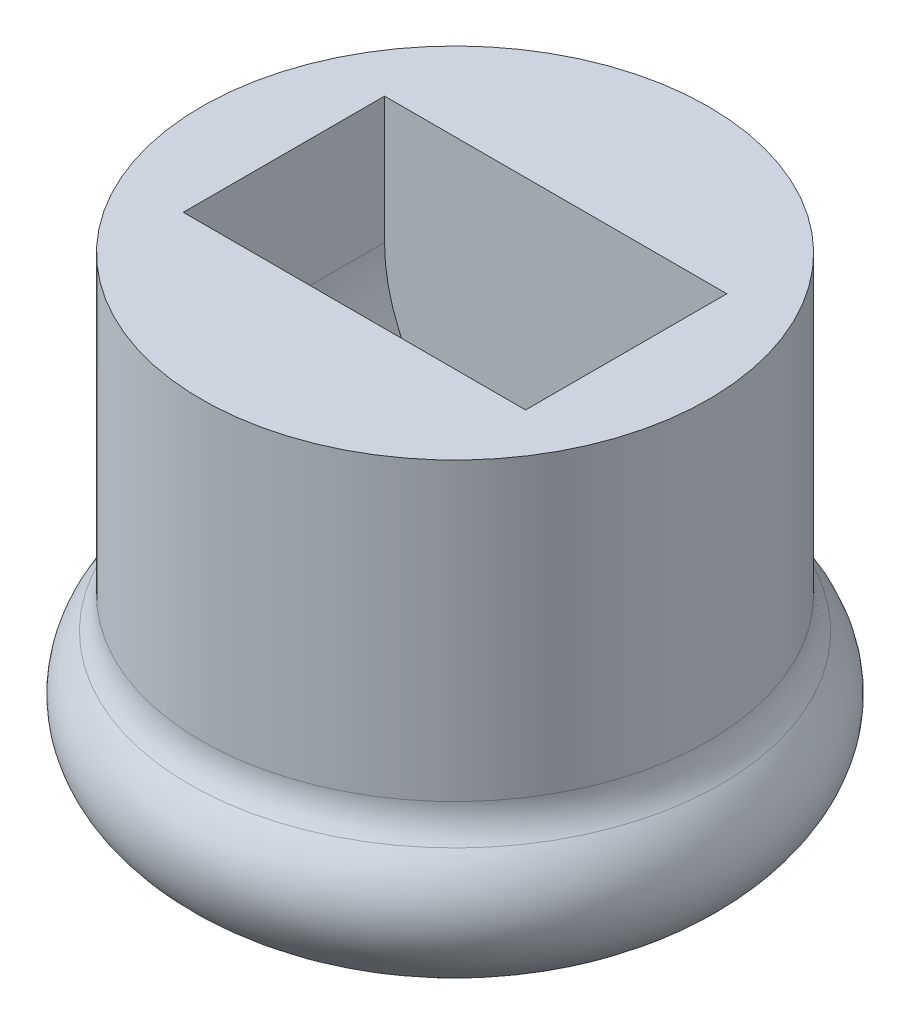
ISO-10303-21;
HEADER;
FILE_DESCRIPTION(('STEP AP214'),'2;1');
FILE_NAME('part.step','',(''),(''),'','','');
FILE_SCHEMA(('AUTOMOTIVE_DESIGN { 1 0 10303 214 1 1 1 1 }'));
ENDSEC;
DATA;
#1=APPLICATION_CONTEXT('core data for automotive mechanical design processes');
#2=APPLICATION_PROTOCOL_DEFINITION('international standard','automotive_design',2000,#1);
#3=PRODUCT_CONTEXT('',#1,'mechanical');
#4=PRODUCT('Part','Part','',(#3));
#5=PRODUCT_RELATED_PRODUCT_CATEGORY('part','',(#4));
#6=PRODUCT_DEFINITION_FORMATION('','',#4);
#7=PRODUCT_DEFINITION_CONTEXT('part definition',#1,'design');
#8=PRODUCT_DEFINITION('design','',#6,#7);
#9=PRODUCT_DEFINITION_SHAPE('','',#8);
#10=(LENGTH_UNIT() NAMED_UNIT(*) SI_UNIT(.MILLI.,.METRE.));
#11=(NAMED_UNIT(*) PLANE_ANGLE_UNIT() SI_UNIT($,.RADIAN.));
#12=(NAMED_UNIT(*) SI_UNIT($,.STERADIAN.) SOLID_ANGLE_UNIT());
#13=UNCERTAINTY_MEASURE_WITH_UNIT(LENGTH_MEASURE(1.E-05),#10,'distance_accuracy_value','');
#14=(GEOMETRIC_REPRESENTATION_CONTEXT(3) GLOBAL_UNCERTAINTY_ASSIGNED_CONTEXT((#13)) GLOBAL_UNIT_ASSIGNED_CONTEXT((#10,
#11,#12)) REPRESENTATION_CONTEXT('',''));
#15=CARTESIAN_POINT('',(0.,0.,0.));
#16=DIRECTION('',(0.,0.,1.));
#17=DIRECTION('',(1.,0.,0.));
#18=AXIS2_PLACEMENT_3D('',#15,#16,#17);
#19=CARTESIAN_POINT('',(0.,1.35221835558166,0.));
#20=DIRECTION('',(0.,-1.,0.));
#21=DIRECTION('',(0.,0.,-1.));
#22=AXIS2_PLACEMENT_3D('',#19,#20,#21);
#23=TOROIDAL_SURFACE('',#22,4.75,0.75);
#24=CARTESIAN_POINT('',(0.,1.35221835558166,0.));
#25=DIRECTION('',(0.,-1.,0.));
#26=DIRECTION('',(0.,0.,-1.));
#27=AXIS2_PLACEMENT_3D('',#24,#25,#26);
#28=CIRCLE('',#27,4.);
#29=CARTESIAN_POINT('',(0.,1.35221835558166,-4.));
#30=VERTEX_POINT('',#29);
#31=EDGE_CURVE('E11',#30,#30,#28,.T.);
#32=ORIENTED_EDGE('',*,*,#31,.T.);
#33=EDGE_LOOP('',(#32));
#34=FACE_BOUND('',#33,.T.);
#35=CARTESIAN_POINT('',(0.,0.853129288488249,0.));
#36=DIRECTION('',(0.,-1.,0.));
#37=DIRECTION('',(0.,0.,-1.));
#38=AXIS2_PLACEMENT_3D('',#35,#36,#37);
#39=CIRCLE('',#38,4.19016957647174);
#40=CARTESIAN_POINT('',(0.,0.853129288488249,-4.19016957647174));
#41=VERTEX_POINT('',#40);
#42=EDGE_CURVE('E99',#41,#41,#39,.T.);
#43=ORIENTED_EDGE('',*,*,#42,.F.);
#44=EDGE_LOOP('',(#43));
#45=FACE_BOUND('',#44,.T.);
#46=ADVANCED_FACE('F39',(#34,#45),#23,.F.);
#47=CARTESIAN_POINT('',(0.,6.01785476441929,0.));
#48=DIRECTION('',(0.,-1.,0.));
#49=DIRECTION('',(0.,0.,-1.));
#50=AXIS2_PLACEMENT_3D('',#47,#48,#49);
#51=CYLINDRICAL_SURFACE('',#50,4.);
#52=CARTESIAN_POINT('',(0.,6.01785476441929,0.));
#53=DIRECTION('',(0.,-1.,0.));
#54=DIRECTION('',(0.,0.,-1.));
#55=AXIS2_PLACEMENT_3D('',#52,#53,#54);
#56=CIRCLE('',#55,4.);
#57=CARTESIAN_POINT('',(0.,6.01785476441929,-4.));
#58=VERTEX_POINT('',#57);
#59=EDGE_CURVE('E47',#58,#58,#56,.T.);
#60=ORIENTED_EDGE('',*,*,#59,.T.);
#61=EDGE_LOOP('',(#60));
#62=FACE_BOUND('',#61,.T.);
#63=ORIENTED_EDGE('',*,*,#31,.F.);
#64=EDGE_LOOP('',(#63));
#65=FACE_BOUND('',#64,.T.);
#66=ADVANCED_FACE('F140',(#62,#65),#51,.T.);
#67=CARTESIAN_POINT('',(0.,6.01785476441929,-4.));
#68=DIRECTION('',(0.,1.,0.));
#69=DIRECTION('',(0.,0.,1.));
#70=AXIS2_PLACEMENT_3D('',#67,#68,#69);
#71=PLANE('',#70);
#72=DIRECTION('',(0.,0.,1.));
#73=VECTOR('',#72,1.);
#74=CARTESIAN_POINT('',(-2.7,6.01785476441929,-1.5875));
#75=LINE('',#74,#73);
#76=CARTESIAN_POINT('',(-2.7,6.01785476441929,-1.5875));
#77=VERTEX_POINT('',#76);
#78=CARTESIAN_POINT('',(-2.7,6.01785476441929,1.5875));
#79=VERTEX_POINT('',#78);
#80=EDGE_CURVE('E54',#77,#79,#75,.T.);
#81=ORIENTED_EDGE('',*,*,#80,.F.);
#82=DIRECTION('',(-1.,0.,0.));
#83=VECTOR('',#82,1.);
#84=CARTESIAN_POINT('',(-2.7,6.01785476441929,-1.5875));
#85=LINE('',#84,#83);
#86=CARTESIAN_POINT('',(2.7,6.01785476441929,-1.5875));
#87=VERTEX_POINT('',#86);
#88=EDGE_CURVE('E97',#87,#77,#85,.T.);
#89=ORIENTED_EDGE('',*,*,#88,.F.);
#90=DIRECTION('',(0.,0.,-1.));
#91=VECTOR('',#90,1.);
#92=CARTESIAN_POINT('',(2.7,6.01785476441929,-1.5875));
#93=LINE('',#92,#91);
#94=CARTESIAN_POINT('',(2.7,6.01785476441929,1.5875));
#95=VERTEX_POINT('',#94);
#96=EDGE_CURVE('E109',#95,#87,#93,.T.);
#97=ORIENTED_EDGE('',*,*,#96,.F.);
#98=DIRECTION('',(1.,0.,0.));
#99=VECTOR('',#98,1.);
#100=CARTESIAN_POINT('',(-2.7,6.01785476441929,1.5875));
#101=LINE('',#100,#99);
#102=EDGE_CURVE('E115',#79,#95,#101,.T.);
#103=ORIENTED_EDGE('',*,*,#102,.F.);
#104=EDGE_LOOP('',(#81,#89,#97,#103));
#105=FACE_BOUND('',#104,.T.);
#106=ORIENTED_EDGE('',*,*,#59,.F.);
#107=EDGE_LOOP('',(#106));
#108=FACE_BOUND('',#107,.T.);
#109=ADVANCED_FACE('F136',(#105,#108),#71,.T.);
#110=CARTESIAN_POINT('',(0.,0.,0.));
#111=DIRECTION('',(1.,0.,0.));
#112=DIRECTION('',(0.,0.,1.));
#113=AXIS2_PLACEMENT_3D('',#110,#111,#112);
#114=ELLIPSE('',#113,4.55460404010155,2.17661427544512);
#115=TRIMMED_CURVE('',#114,(PARAMETER_VALUE(1.5707963267949)),
(PARAMETER_VALUE(4.71238898038469)),.T.,.PARAMETER.);
#116=CARTESIAN_POINT('',(0.,6.01785476441929,0.));
#117=DIRECTION('',(0.,-1.,0.));
#118=AXIS1_PLACEMENT('',#116,#117);
#119=SURFACE_OF_REVOLUTION('',#115,#118);
#120=ORIENTED_EDGE('',*,*,#42,.T.);
#121=EDGE_LOOP('',(#120));
#122=FACE_BOUND('',#121,.T.);
#123=CARTESIAN_POINT('',(0.,-2.17661427544512,0.));
#124=VERTEX_POINT('',#123);
#125=VERTEX_LOOP('',#124);
#126=FACE_BOUND('',#125,.T.);
#127=ADVANCED_FACE('F132',(#122,#126),#119,.F.);
#128=CARTESIAN_POINT('',(-2.7,4.01785476441929,-1.5875));
#129=DIRECTION('',(-1.,0.,0.));
#130=DIRECTION('',(0.,0.,1.));
#131=AXIS2_PLACEMENT_3D('',#128,#129,#130);
#132=PLANE('',#131);
#133=ORIENTED_EDGE('',*,*,#80,.T.);
#134=DIRECTION('',(0.,1.,0.));
#135=VECTOR('',#134,1.);
#136=CARTESIAN_POINT('',(-2.7,4.01785476441929,1.5875));
#137=LINE('',#136,#135);
#138=CARTESIAN_POINT('',(-2.7,4.01785476441929,1.5875));
#139=VERTEX_POINT('',#138);
#140=EDGE_CURVE('E103',#139,#79,#137,.T.);
#141=ORIENTED_EDGE('',*,*,#140,.F.);
#142=DIRECTION('',(0.,0.,1.));
#143=VECTOR('',#142,1.);
#144=CARTESIAN_POINT('',(-2.7,4.01785476441929,-1.5875));
#145=LINE('',#144,#143);
#146=CARTESIAN_POINT('',(-2.7,4.01785476441929,-1.5875));
#147=VERTEX_POINT('',#146);
#148=EDGE_CURVE('E85',#147,#139,#145,.T.);
#149=ORIENTED_EDGE('',*,*,#148,.F.);
#150=DIRECTION('',(0.,1.,0.));
#151=VECTOR('',#150,1.);
#152=CARTESIAN_POINT('',(-2.7,4.01785476441929,-1.5875));
#153=LINE('',#152,#151);
#154=EDGE_CURVE('E94',#147,#77,#153,.T.);
#155=ORIENTED_EDGE('',*,*,#154,.T.);
#156=EDGE_LOOP('',(#133,#141,#149,#155));
#157=FACE_BOUND('',#156,.T.);
#158=ADVANCED_FACE('F102',(#157),#132,.F.);
#159=CARTESIAN_POINT('',(-2.7,4.01785476441929,-1.5875));
#160=DIRECTION('',(0.,0.,-1.));
#161=DIRECTION('',(-1.,0.,0.));
#162=AXIS2_PLACEMENT_3D('',#159,#160,#161);
#163=PLANE('',#162);
#164=ORIENTED_EDGE('',*,*,#154,.F.);
#165=CARTESIAN_POINT('',(0.,4.01785476441929,-1.5875));
#166=DIRECTION('',(0.,0.,1.));
#167=DIRECTION('',(1.,0.,0.));
#168=AXIS2_PLACEMENT_3D('',#165,#166,#167);
#169=CIRCLE('',#168,2.7);
#170=CARTESIAN_POINT('',(2.7,4.01785476441929,-1.5875));
#171=VERTEX_POINT('',#170);
#172=EDGE_CURVE('E81',#147,#171,#169,.T.);
#173=ORIENTED_EDGE('',*,*,#172,.T.);
#174=DIRECTION('',(0.,1.,0.));
#175=VECTOR('',#174,1.);
#176=CARTESIAN_POINT('',(2.7,4.01785476441929,-1.5875));
#177=LINE('',#176,#175);
#178=EDGE_CURVE('E100',#171,#87,#177,.T.);
#179=ORIENTED_EDGE('',*,*,#178,.T.);
#180=ORIENTED_EDGE('',*,*,#88,.T.);
#181=EDGE_LOOP('',(#164,#173,#179,#180));
#182=FACE_BOUND('',#181,.T.);
#183=ADVANCED_FACE('F95',(#182),#163,.F.);
#184=CARTESIAN_POINT('',(2.7,4.01785476441929,-1.5875));
#185=DIRECTION('',(1.,0.,0.));
#186=DIRECTION('',(0.,0.,-1.));
#187=AXIS2_PLACEMENT_3D('',#184,#185,#186);
#188=PLANE('',#187);
#189=ORIENTED_EDGE('',*,*,#96,.T.);
#190=ORIENTED_EDGE('',*,*,#178,.F.);
#191=DIRECTION('',(0.,0.,-1.));
#192=VECTOR('',#191,1.);
#193=CARTESIAN_POINT('',(2.7,4.01785476441929,-1.5875));
#194=LINE('',#193,#192);
#195=CARTESIAN_POINT('',(2.7,4.01785476441929,1.5875));
#196=VERTEX_POINT('',#195);
#197=EDGE_CURVE('E88',#196,#171,#194,.T.);
#198=ORIENTED_EDGE('',*,*,#197,.F.);
#199=DIRECTION('',(0.,1.,0.));
#200=VECTOR('',#199,1.);
#201=CARTESIAN_POINT('',(2.7,4.01785476441929,1.5875));
#202=LINE('',#201,#200);
#203=EDGE_CURVE('E123',#196,#95,#202,.T.);
#204=ORIENTED_EDGE('',*,*,#203,.T.);
#205=EDGE_LOOP('',(#189,#190,#198,#204));
#206=FACE_BOUND('',#205,.T.);
#207=ADVANCED_FACE('F193',(#206),#188,.F.);
#208=CARTESIAN_POINT('',(-2.7,4.01785476441929,1.5875));
#209=DIRECTION('',(0.,0.,1.));
#210=DIRECTION('',(1.,0.,0.));
#211=AXIS2_PLACEMENT_3D('',#208,#209,#210);
#212=PLANE('',#211);
#213=ORIENTED_EDGE('',*,*,#203,.F.);
#214=CARTESIAN_POINT('',(0.,4.01785476441929,1.5875));
#215=DIRECTION('',(0.,0.,1.));
#216=DIRECTION('',(1.,0.,0.));
#217=AXIS2_PLACEMENT_3D('',#214,#215,#216);
#218=CIRCLE('',#217,2.7);
#219=EDGE_CURVE('E92',#139,#196,#218,.T.);
#220=ORIENTED_EDGE('',*,*,#219,.F.);
#221=ORIENTED_EDGE('',*,*,#140,.T.);
#222=ORIENTED_EDGE('',*,*,#102,.T.);
#223=EDGE_LOOP('',(#213,#220,#221,#222));
#224=FACE_BOUND('',#223,.T.);
#225=ADVANCED_FACE('F204',(#224),#212,.F.);
#226=CARTESIAN_POINT('',(0.,4.01785476441929,1.5875));
#227=DIRECTION('',(0.,0.,-1.));
#228=DIRECTION('',(-1.,0.,0.));
#229=AXIS2_PLACEMENT_3D('',#226,#227,#228);
#230=CYLINDRICAL_SURFACE('',#229,2.7);
#231=ORIENTED_EDGE('',*,*,#172,.F.);
#232=ORIENTED_EDGE('',*,*,#148,.T.);
#233=ORIENTED_EDGE('',*,*,#219,.T.);
#234=ORIENTED_EDGE('',*,*,#197,.T.);
#235=EDGE_LOOP('',(#231,#232,#233,#234));
#236=FACE_BOUND('',#235,.T.);
#237=ADVANCED_FACE('F83',(#236),#230,.F.);
#238=CLOSED_SHELL('',(#46,#66,#109,#127,#158,#183,#207,#225,#237));
#239=MANIFOLD_SOLID_BREP('B2',#238);
#240=ADVANCED_BREP_SHAPE_REPRESENTATION('',(#18,#239),#14);
#241=SHAPE_DEFINITION_REPRESENTATION(#9,#240);
ENDSEC;
END-ISO-10303-21;
